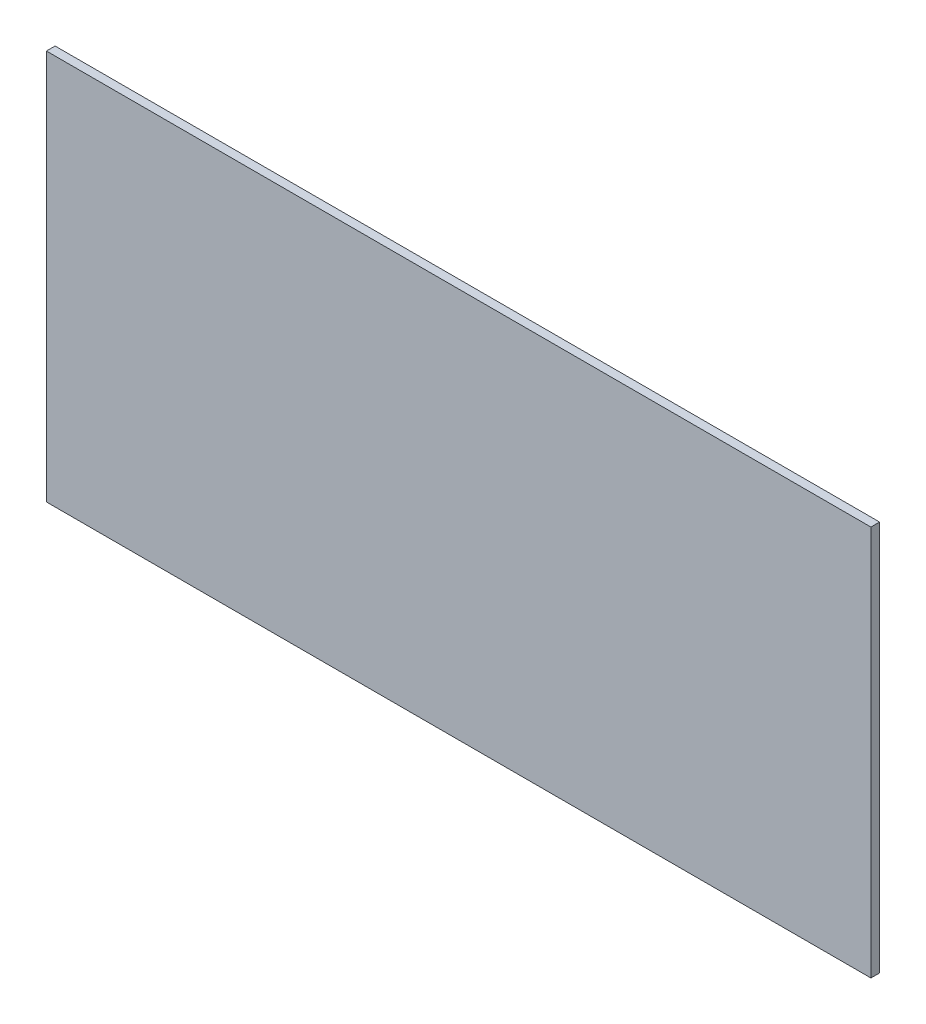
ISO-10303-21;
HEADER;
FILE_DESCRIPTION(('STEP AP214'),'2;1');
FILE_NAME('part.step','',(''),(''),'','','');
FILE_SCHEMA(('AUTOMOTIVE_DESIGN { 1 0 10303 214 1 1 1 1 }'));
ENDSEC;
DATA;
#1=APPLICATION_CONTEXT('core data for automotive mechanical design processes');
#2=APPLICATION_PROTOCOL_DEFINITION('international standard','automotive_design',2000,#1);
#3=PRODUCT_CONTEXT('',#1,'mechanical');
#4=PRODUCT('Part','Part','',(#3));
#5=PRODUCT_RELATED_PRODUCT_CATEGORY('part','',(#4));
#6=PRODUCT_DEFINITION_FORMATION('','',#4);
#7=PRODUCT_DEFINITION_CONTEXT('part definition',#1,'design');
#8=PRODUCT_DEFINITION('design','',#6,#7);
#9=PRODUCT_DEFINITION_SHAPE('','',#8);
#10=(LENGTH_UNIT() NAMED_UNIT(*) SI_UNIT(.MILLI.,.METRE.));
#11=(NAMED_UNIT(*) PLANE_ANGLE_UNIT() SI_UNIT($,.RADIAN.));
#12=(NAMED_UNIT(*) SI_UNIT($,.STERADIAN.) SOLID_ANGLE_UNIT());
#13=UNCERTAINTY_MEASURE_WITH_UNIT(LENGTH_MEASURE(1.E-05),#10,'distance_accuracy_value','');
#14=(GEOMETRIC_REPRESENTATION_CONTEXT(3) GLOBAL_UNCERTAINTY_ASSIGNED_CONTEXT((#13)) GLOBAL_UNIT_ASSIGNED_CONTEXT((#10,
#11,#12)) REPRESENTATION_CONTEXT('',''));
#15=CARTESIAN_POINT('',(0.,0.,0.));
#16=DIRECTION('',(0.,0.,1.));
#17=DIRECTION('',(1.,0.,0.));
#18=AXIS2_PLACEMENT_3D('',#15,#16,#17);
#19=CARTESIAN_POINT('',(0.,0.,2.));
#20=DIRECTION('',(1.,0.,0.));
#21=DIRECTION('',(0.,0.,-1.));
#22=AXIS2_PLACEMENT_3D('',#19,#20,#21);
#23=PLANE('',#22);
#24=DIRECTION('',(0.,-1.,0.));
#25=VECTOR('',#24,1.);
#26=CARTESIAN_POINT('',(0.,0.,0.));
#27=LINE('',#26,#25);
#28=CARTESIAN_POINT('',(0.,90.,0.));
#29=VERTEX_POINT('',#28);
#30=CARTESIAN_POINT('',(0.,0.,0.));
#31=VERTEX_POINT('',#30);
#32=EDGE_CURVE('E105',#29,#31,#27,.T.);
#33=ORIENTED_EDGE('',*,*,#32,.T.);
#34=DIRECTION('',(0.,0.,-1.));
#35=VECTOR('',#34,1.);
#36=CARTESIAN_POINT('',(0.,0.,2.));
#37=LINE('',#36,#35);
#38=CARTESIAN_POINT('',(0.,0.,2.));
#39=VERTEX_POINT('',#38);
#40=EDGE_CURVE('E11',#39,#31,#37,.T.);
#41=ORIENTED_EDGE('',*,*,#40,.F.);
#42=DIRECTION('',(0.,-1.,0.));
#43=VECTOR('',#42,1.);
#44=CARTESIAN_POINT('',(0.,0.,2.));
#45=LINE('',#44,#43);
#46=CARTESIAN_POINT('',(0.,90.,2.));
#47=VERTEX_POINT('',#46);
#48=EDGE_CURVE('E89',#47,#39,#45,.T.);
#49=ORIENTED_EDGE('',*,*,#48,.F.);
#50=DIRECTION('',(0.,0.,-1.));
#51=VECTOR('',#50,1.);
#52=CARTESIAN_POINT('',(0.,90.,2.));
#53=LINE('',#52,#51);
#54=EDGE_CURVE('E97',#47,#29,#53,.T.);
#55=ORIENTED_EDGE('',*,*,#54,.T.);
#56=EDGE_LOOP('',(#33,#41,#49,#55));
#57=FACE_BOUND('',#56,.T.);
#58=ADVANCED_FACE('F39',(#57),#23,.F.);
#59=CARTESIAN_POINT('',(0.,0.,2.));
#60=DIRECTION('',(0.,1.,0.));
#61=DIRECTION('',(0.,0.,1.));
#62=AXIS2_PLACEMENT_3D('',#59,#60,#61);
#63=PLANE('',#62);
#64=DIRECTION('',(1.,0.,0.));
#65=VECTOR('',#64,1.);
#66=CARTESIAN_POINT('',(0.,0.,0.));
#67=LINE('',#66,#65);
#68=CARTESIAN_POINT('',(190.,0.,0.));
#69=VERTEX_POINT('',#68);
#70=EDGE_CURVE('E92',#31,#69,#67,.T.);
#71=ORIENTED_EDGE('',*,*,#70,.T.);
#72=DIRECTION('',(0.,0.,-1.));
#73=VECTOR('',#72,1.);
#74=CARTESIAN_POINT('',(190.,0.,2.));
#75=LINE('',#74,#73);
#76=CARTESIAN_POINT('',(190.,0.,2.));
#77=VERTEX_POINT('',#76);
#78=EDGE_CURVE('E50',#77,#69,#75,.T.);
#79=ORIENTED_EDGE('',*,*,#78,.F.);
#80=DIRECTION('',(1.,0.,0.));
#81=VECTOR('',#80,1.);
#82=CARTESIAN_POINT('',(0.,0.,2.));
#83=LINE('',#82,#81);
#84=EDGE_CURVE('E82',#39,#77,#83,.T.);
#85=ORIENTED_EDGE('',*,*,#84,.F.);
#86=ORIENTED_EDGE('',*,*,#40,.T.);
#87=EDGE_LOOP('',(#71,#79,#85,#86));
#88=FACE_BOUND('',#87,.T.);
#89=ADVANCED_FACE('F93',(#88),#63,.F.);
#90=CARTESIAN_POINT('',(190.,0.,2.));
#91=DIRECTION('',(-1.,0.,0.));
#92=DIRECTION('',(0.,0.,1.));
#93=AXIS2_PLACEMENT_3D('',#90,#91,#92);
#94=PLANE('',#93);
#95=DIRECTION('',(0.,1.,0.));
#96=VECTOR('',#95,1.);
#97=CARTESIAN_POINT('',(190.,0.,0.));
#98=LINE('',#97,#96);
#99=CARTESIAN_POINT('',(190.,90.,0.));
#100=VERTEX_POINT('',#99);
#101=EDGE_CURVE('E72',#69,#100,#98,.T.);
#102=ORIENTED_EDGE('',*,*,#101,.T.);
#103=DIRECTION('',(0.,0.,-1.));
#104=VECTOR('',#103,1.);
#105=CARTESIAN_POINT('',(190.,90.,2.));
#106=LINE('',#105,#104);
#107=CARTESIAN_POINT('',(190.,90.,2.));
#108=VERTEX_POINT('',#107);
#109=EDGE_CURVE('E94',#108,#100,#106,.T.);
#110=ORIENTED_EDGE('',*,*,#109,.F.);
#111=DIRECTION('',(0.,1.,0.));
#112=VECTOR('',#111,1.);
#113=CARTESIAN_POINT('',(190.,0.,2.));
#114=LINE('',#113,#112);
#115=EDGE_CURVE('E88',#77,#108,#114,.T.);
#116=ORIENTED_EDGE('',*,*,#115,.F.);
#117=ORIENTED_EDGE('',*,*,#78,.T.);
#118=EDGE_LOOP('',(#102,#110,#116,#117));
#119=FACE_BOUND('',#118,.T.);
#120=ADVANCED_FACE('F96',(#119),#94,.F.);
#121=CARTESIAN_POINT('',(0.,90.,2.));
#122=DIRECTION('',(0.,-1.,0.));
#123=DIRECTION('',(0.,0.,-1.));
#124=AXIS2_PLACEMENT_3D('',#121,#122,#123);
#125=PLANE('',#124);
#126=DIRECTION('',(-1.,0.,0.));
#127=VECTOR('',#126,1.);
#128=CARTESIAN_POINT('',(0.,90.,0.));
#129=LINE('',#128,#127);
#130=EDGE_CURVE('E76',#100,#29,#129,.T.);
#131=ORIENTED_EDGE('',*,*,#130,.T.);
#132=ORIENTED_EDGE('',*,*,#54,.F.);
#133=DIRECTION('',(-1.,0.,0.));
#134=VECTOR('',#133,1.);
#135=CARTESIAN_POINT('',(0.,90.,2.));
#136=LINE('',#135,#134);
#137=EDGE_CURVE('E54',#108,#47,#136,.T.);
#138=ORIENTED_EDGE('',*,*,#137,.F.);
#139=ORIENTED_EDGE('',*,*,#109,.T.);
#140=EDGE_LOOP('',(#131,#132,#138,#139));
#141=FACE_BOUND('',#140,.T.);
#142=ADVANCED_FACE('F108',(#141),#125,.F.);
#143=CARTESIAN_POINT('',(0.,0.,2.));
#144=DIRECTION('',(0.,0.,-1.));
#145=DIRECTION('',(-1.,0.,0.));
#146=AXIS2_PLACEMENT_3D('',#143,#144,#145);
#147=PLANE('',#146);
#148=ORIENTED_EDGE('',*,*,#48,.T.);
#149=ORIENTED_EDGE('',*,*,#84,.T.);
#150=ORIENTED_EDGE('',*,*,#115,.T.);
#151=ORIENTED_EDGE('',*,*,#137,.T.);
#152=EDGE_LOOP('',(#148,#149,#150,#151));
#153=FACE_BOUND('',#152,.T.);
#154=ADVANCED_FACE('F86',(#153),#147,.F.);
#155=CARTESIAN_POINT('',(0.,0.,0.));
#156=DIRECTION('',(0.,0.,-1.));
#157=DIRECTION('',(-1.,0.,0.));
#158=AXIS2_PLACEMENT_3D('',#155,#156,#157);
#159=PLANE('',#158);
#160=ORIENTED_EDGE('',*,*,#32,.F.);
#161=ORIENTED_EDGE('',*,*,#130,.F.);
#162=ORIENTED_EDGE('',*,*,#101,.F.);
#163=ORIENTED_EDGE('',*,*,#70,.F.);
#164=EDGE_LOOP('',(#160,#161,#162,#163));
#165=FACE_BOUND('',#164,.T.);
#166=ADVANCED_FACE('F115',(#165),#159,.T.);
#167=CLOSED_SHELL('',(#58,#89,#120,#142,#154,#166));
#168=MANIFOLD_SOLID_BREP('B2',#167);
#169=ADVANCED_BREP_SHAPE_REPRESENTATION('',(#18,#168),#14);
#170=SHAPE_DEFINITION_REPRESENTATION(#9,#169);
ENDSEC;
END-ISO-10303-21;
